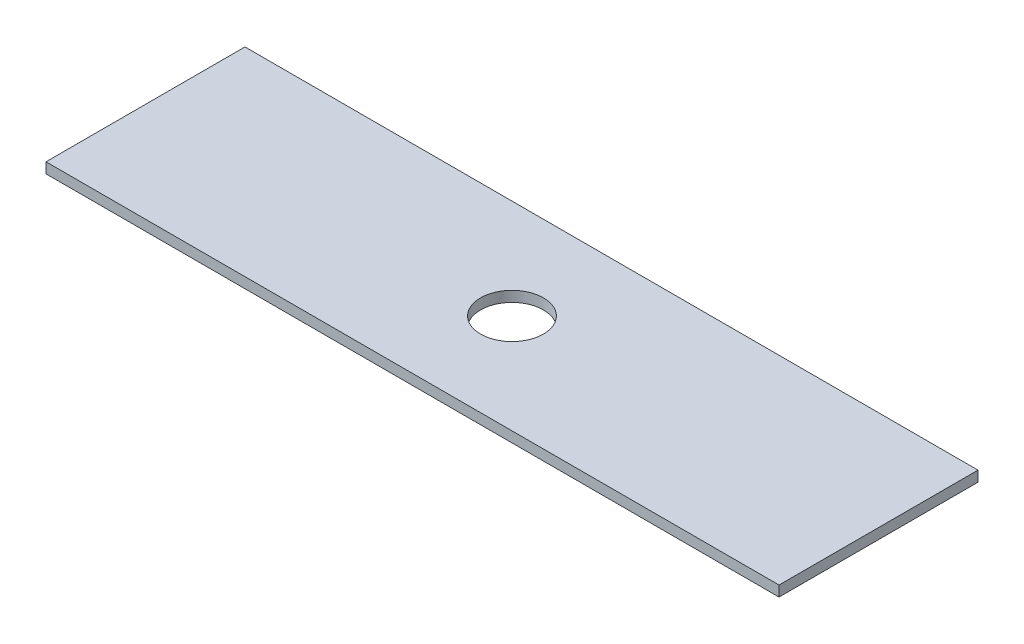
ISO-10303-21;
HEADER;
FILE_DESCRIPTION(('STEP AP214'),'2;1');
FILE_NAME('part.step','',(''),(''),'','','');
FILE_SCHEMA(('AUTOMOTIVE_DESIGN { 1 0 10303 214 1 1 1 1 }'));
ENDSEC;
DATA;
#1=APPLICATION_CONTEXT('core data for automotive mechanical design processes');
#2=APPLICATION_PROTOCOL_DEFINITION('international standard','automotive_design',2000,#1);
#3=PRODUCT_CONTEXT('',#1,'mechanical');
#4=PRODUCT('Part','Part','',(#3));
#5=PRODUCT_RELATED_PRODUCT_CATEGORY('part','',(#4));
#6=PRODUCT_DEFINITION_FORMATION('','',#4);
#7=PRODUCT_DEFINITION_CONTEXT('part definition',#1,'design');
#8=PRODUCT_DEFINITION('design','',#6,#7);
#9=PRODUCT_DEFINITION_SHAPE('','',#8);
#10=(LENGTH_UNIT() NAMED_UNIT(*) SI_UNIT(.MILLI.,.METRE.));
#11=(NAMED_UNIT(*) PLANE_ANGLE_UNIT() SI_UNIT($,.RADIAN.));
#12=(NAMED_UNIT(*) SI_UNIT($,.STERADIAN.) SOLID_ANGLE_UNIT());
#13=UNCERTAINTY_MEASURE_WITH_UNIT(LENGTH_MEASURE(1.E-05),#10,'distance_accuracy_value','');
#14=(GEOMETRIC_REPRESENTATION_CONTEXT(3) GLOBAL_UNCERTAINTY_ASSIGNED_CONTEXT((#13)) GLOBAL_UNIT_ASSIGNED_CONTEXT((#10,
#11,#12)) REPRESENTATION_CONTEXT('',''));
#15=CARTESIAN_POINT('',(0.,0.,0.));
#16=DIRECTION('',(0.,0.,1.));
#17=DIRECTION('',(1.,0.,0.));
#18=AXIS2_PLACEMENT_3D('',#15,#16,#17);
#19=CARTESIAN_POINT('',(350.,10.,95.));
#20=DIRECTION('',(-1.,0.,0.));
#21=DIRECTION('',(0.,0.,1.));
#22=AXIS2_PLACEMENT_3D('',#19,#20,#21);
#23=PLANE('',#22);
#24=DIRECTION('',(0.,0.,-1.));
#25=VECTOR('',#24,1.);
#26=CARTESIAN_POINT('',(350.,0.,95.));
#27=LINE('',#26,#25);
#28=CARTESIAN_POINT('',(350.,0.,95.));
#29=VERTEX_POINT('',#28);
#30=CARTESIAN_POINT('',(350.,0.,-95.));
#31=VERTEX_POINT('',#30);
#32=EDGE_CURVE('E96',#29,#31,#27,.T.);
#33=ORIENTED_EDGE('',*,*,#32,.T.);
#34=DIRECTION('',(0.,-1.,0.));
#35=VECTOR('',#34,1.);
#36=CARTESIAN_POINT('',(350.,10.,-95.));
#37=LINE('',#36,#35);
#38=CARTESIAN_POINT('',(350.,10.,-95.));
#39=VERTEX_POINT('',#38);
#40=EDGE_CURVE('E11',#39,#31,#37,.T.);
#41=ORIENTED_EDGE('',*,*,#40,.F.);
#42=DIRECTION('',(0.,0.,-1.));
#43=VECTOR('',#42,1.);
#44=CARTESIAN_POINT('',(350.,10.,95.));
#45=LINE('',#44,#43);
#46=CARTESIAN_POINT('',(350.,10.,95.));
#47=VERTEX_POINT('',#46);
#48=EDGE_CURVE('E84',#47,#39,#45,.T.);
#49=ORIENTED_EDGE('',*,*,#48,.F.);
#50=DIRECTION('',(0.,-1.,0.));
#51=VECTOR('',#50,1.);
#52=CARTESIAN_POINT('',(350.,10.,95.));
#53=LINE('',#52,#51);
#54=EDGE_CURVE('E92',#47,#29,#53,.T.);
#55=ORIENTED_EDGE('',*,*,#54,.T.);
#56=EDGE_LOOP('',(#33,#41,#49,#55));
#57=FACE_BOUND('',#56,.T.);
#58=ADVANCED_FACE('F33',(#57),#23,.F.);
#59=CARTESIAN_POINT('',(-350.,10.,-95.));
#60=DIRECTION('',(0.,0.,1.));
#61=DIRECTION('',(1.,0.,0.));
#62=AXIS2_PLACEMENT_3D('',#59,#60,#61);
#63=PLANE('',#62);
#64=DIRECTION('',(-1.,0.,0.));
#65=VECTOR('',#64,1.);
#66=CARTESIAN_POINT('',(-350.,0.,-95.));
#67=LINE('',#66,#65);
#68=CARTESIAN_POINT('',(-350.,0.,-95.));
#69=VERTEX_POINT('',#68);
#70=EDGE_CURVE('E88',#31,#69,#67,.T.);
#71=ORIENTED_EDGE('',*,*,#70,.T.);
#72=DIRECTION('',(0.,-1.,0.));
#73=VECTOR('',#72,1.);
#74=CARTESIAN_POINT('',(-350.,10.,-95.));
#75=LINE('',#74,#73);
#76=CARTESIAN_POINT('',(-350.,10.,-95.));
#77=VERTEX_POINT('',#76);
#78=EDGE_CURVE('E41',#77,#69,#75,.T.);
#79=ORIENTED_EDGE('',*,*,#78,.F.);
#80=DIRECTION('',(-1.,0.,0.));
#81=VECTOR('',#80,1.);
#82=CARTESIAN_POINT('',(-350.,10.,-95.));
#83=LINE('',#82,#81);
#84=EDGE_CURVE('E79',#39,#77,#83,.T.);
#85=ORIENTED_EDGE('',*,*,#84,.F.);
#86=ORIENTED_EDGE('',*,*,#40,.T.);
#87=EDGE_LOOP('',(#71,#79,#85,#86));
#88=FACE_BOUND('',#87,.T.);
#89=ADVANCED_FACE('F87',(#88),#63,.F.);
#90=CARTESIAN_POINT('',(-350.,10.,95.));
#91=DIRECTION('',(1.,0.,0.));
#92=DIRECTION('',(0.,0.,-1.));
#93=AXIS2_PLACEMENT_3D('',#90,#91,#92);
#94=PLANE('',#93);
#95=DIRECTION('',(0.,0.,1.));
#96=VECTOR('',#95,1.);
#97=CARTESIAN_POINT('',(-350.,0.,95.));
#98=LINE('',#97,#96);
#99=CARTESIAN_POINT('',(-350.,0.,95.));
#100=VERTEX_POINT('',#99);
#101=EDGE_CURVE('E66',#69,#100,#98,.T.);
#102=ORIENTED_EDGE('',*,*,#101,.T.);
#103=DIRECTION('',(0.,-1.,0.));
#104=VECTOR('',#103,1.);
#105=CARTESIAN_POINT('',(-350.,10.,95.));
#106=LINE('',#105,#104);
#107=CARTESIAN_POINT('',(-350.,10.,95.));
#108=VERTEX_POINT('',#107);
#109=EDGE_CURVE('E89',#108,#100,#106,.T.);
#110=ORIENTED_EDGE('',*,*,#109,.F.);
#111=DIRECTION('',(0.,0.,1.));
#112=VECTOR('',#111,1.);
#113=CARTESIAN_POINT('',(-350.,10.,95.));
#114=LINE('',#113,#112);
#115=EDGE_CURVE('E82',#77,#108,#114,.T.);
#116=ORIENTED_EDGE('',*,*,#115,.F.);
#117=ORIENTED_EDGE('',*,*,#78,.T.);
#118=EDGE_LOOP('',(#102,#110,#116,#117));
#119=FACE_BOUND('',#118,.T.);
#120=ADVANCED_FACE('F90',(#119),#94,.F.);
#121=CARTESIAN_POINT('',(-350.,10.,95.));
#122=DIRECTION('',(0.,0.,-1.));
#123=DIRECTION('',(-1.,0.,0.));
#124=AXIS2_PLACEMENT_3D('',#121,#122,#123);
#125=PLANE('',#124);
#126=DIRECTION('',(1.,0.,0.));
#127=VECTOR('',#126,1.);
#128=CARTESIAN_POINT('',(-350.,0.,95.));
#129=LINE('',#128,#127);
#130=EDGE_CURVE('E72',#100,#29,#129,.T.);
#131=ORIENTED_EDGE('',*,*,#130,.T.);
#132=ORIENTED_EDGE('',*,*,#54,.F.);
#133=DIRECTION('',(1.,0.,0.));
#134=VECTOR('',#133,1.);
#135=CARTESIAN_POINT('',(-350.,10.,95.));
#136=LINE('',#135,#134);
#137=EDGE_CURVE('E49',#108,#47,#136,.T.);
#138=ORIENTED_EDGE('',*,*,#137,.F.);
#139=ORIENTED_EDGE('',*,*,#109,.T.);
#140=EDGE_LOOP('',(#131,#132,#138,#139));
#141=FACE_BOUND('',#140,.T.);
#142=ADVANCED_FACE('F104',(#141),#125,.F.);
#143=CARTESIAN_POINT('',(0.,10.,0.));
#144=DIRECTION('',(0.,-1.,0.));
#145=DIRECTION('',(0.,0.,-1.));
#146=AXIS2_PLACEMENT_3D('',#143,#144,#145);
#147=PLANE('',#146);
#148=CARTESIAN_POINT('',(0.,10.,0.));
#149=DIRECTION('',(0.,1.,0.));
#150=DIRECTION('',(0.,0.,1.));
#151=AXIS2_PLACEMENT_3D('',#148,#149,#150);
#152=CIRCLE('',#151,30.);
#153=CARTESIAN_POINT('',(0.,10.,30.));
#154=VERTEX_POINT('',#153);
#155=EDGE_CURVE('E112',#154,#154,#152,.T.);
#156=ORIENTED_EDGE('',*,*,#155,.F.);
#157=EDGE_LOOP('',(#156));
#158=FACE_BOUND('',#157,.T.);
#159=ORIENTED_EDGE('',*,*,#48,.T.);
#160=ORIENTED_EDGE('',*,*,#84,.T.);
#161=ORIENTED_EDGE('',*,*,#115,.T.);
#162=ORIENTED_EDGE('',*,*,#137,.T.);
#163=EDGE_LOOP('',(#159,#160,#161,#162));
#164=FACE_BOUND('',#163,.T.);
#165=ADVANCED_FACE('F80',(#158,#164),#147,.F.);
#166=CARTESIAN_POINT('',(0.,0.,0.));
#167=DIRECTION('',(0.,-1.,0.));
#168=DIRECTION('',(0.,0.,-1.));
#169=AXIS2_PLACEMENT_3D('',#166,#167,#168);
#170=PLANE('',#169);
#171=CARTESIAN_POINT('',(0.,0.,0.));
#172=DIRECTION('',(0.,-1.,0.));
#173=DIRECTION('',(0.,0.,-1.));
#174=AXIS2_PLACEMENT_3D('',#171,#172,#173);
#175=CIRCLE('',#174,30.);
#176=CARTESIAN_POINT('',(0.,0.,-30.));
#177=VERTEX_POINT('',#176);
#178=EDGE_CURVE('E99',#177,#177,#175,.F.);
#179=ORIENTED_EDGE('',*,*,#178,.T.);
#180=EDGE_LOOP('',(#179));
#181=FACE_BOUND('',#180,.T.);
#182=ORIENTED_EDGE('',*,*,#32,.F.);
#183=ORIENTED_EDGE('',*,*,#130,.F.);
#184=ORIENTED_EDGE('',*,*,#101,.F.);
#185=ORIENTED_EDGE('',*,*,#70,.F.);
#186=EDGE_LOOP('',(#182,#183,#184,#185));
#187=FACE_BOUND('',#186,.T.);
#188=ADVANCED_FACE('F107',(#181,#187),#170,.T.);
#189=CARTESIAN_POINT('',(0.,-84.8528137423857,0.));
#190=DIRECTION('',(0.,1.,0.));
#191=DIRECTION('',(0.,0.,1.));
#192=AXIS2_PLACEMENT_3D('',#189,#190,#191);
#193=CYLINDRICAL_SURFACE('',#192,30.);
#194=ORIENTED_EDGE('',*,*,#155,.T.);
#195=EDGE_LOOP('',(#194));
#196=FACE_BOUND('',#195,.T.);
#197=ORIENTED_EDGE('',*,*,#178,.F.);
#198=EDGE_LOOP('',(#197));
#199=FACE_BOUND('',#198,.T.);
#200=ADVANCED_FACE('F116',(#196,#199),#193,.F.);
#201=CLOSED_SHELL('',(#58,#89,#120,#142,#165,#188,#200));
#202=MANIFOLD_SOLID_BREP('B2',#201);
#203=ADVANCED_BREP_SHAPE_REPRESENTATION('',(#18,#202),#14);
#204=SHAPE_DEFINITION_REPRESENTATION(#9,#203);
ENDSEC;
END-ISO-10303-21;
